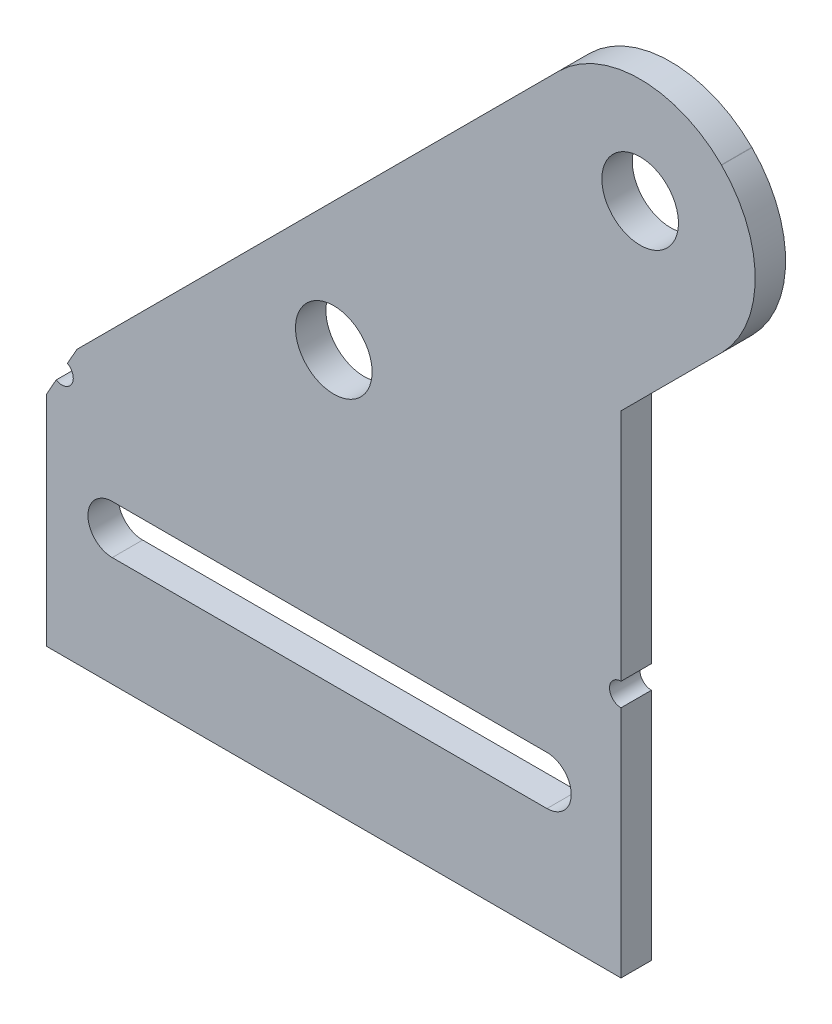
ISO-10303-21;
HEADER;
FILE_DESCRIPTION(('STEP AP214'),'2;1');
FILE_NAME('part.step','',(''),(''),'','','');
FILE_SCHEMA(('AUTOMOTIVE_DESIGN { 1 0 10303 214 1 1 1 1 }'));
ENDSEC;
DATA;
#1=APPLICATION_CONTEXT('core data for automotive mechanical design processes');
#2=APPLICATION_PROTOCOL_DEFINITION('international standard','automotive_design',2000,#1);
#3=PRODUCT_CONTEXT('',#1,'mechanical');
#4=PRODUCT('Part','Part','',(#3));
#5=PRODUCT_RELATED_PRODUCT_CATEGORY('part','',(#4));
#6=PRODUCT_DEFINITION_FORMATION('','',#4);
#7=PRODUCT_DEFINITION_CONTEXT('part definition',#1,'design');
#8=PRODUCT_DEFINITION('design','',#6,#7);
#9=PRODUCT_DEFINITION_SHAPE('','',#8);
#10=(LENGTH_UNIT() NAMED_UNIT(*) SI_UNIT(.MILLI.,.METRE.));
#11=(NAMED_UNIT(*) PLANE_ANGLE_UNIT() SI_UNIT($,.RADIAN.));
#12=(NAMED_UNIT(*) SI_UNIT($,.STERADIAN.) SOLID_ANGLE_UNIT());
#13=UNCERTAINTY_MEASURE_WITH_UNIT(LENGTH_MEASURE(1.E-05),#10,'distance_accuracy_value','');
#14=(GEOMETRIC_REPRESENTATION_CONTEXT(3) GLOBAL_UNCERTAINTY_ASSIGNED_CONTEXT((#13)) GLOBAL_UNIT_ASSIGNED_CONTEXT((#10,
#11,#12)) REPRESENTATION_CONTEXT('',''));
#15=CARTESIAN_POINT('',(0.,0.,0.));
#16=DIRECTION('',(0.,0.,1.));
#17=DIRECTION('',(1.,0.,0.));
#18=AXIS2_PLACEMENT_3D('',#15,#16,#17);
#19=CARTESIAN_POINT('',(75.,6.78692044405827,0.));
#20=DIRECTION('',(-1.,0.,0.));
#21=DIRECTION('',(0.,-1.,0.));
#22=AXIS2_PLACEMENT_3D('',#19,#20,#21);
#23=PLANE('',#22);
#24=DIRECTION('',(0.,0.,1.));
#25=VECTOR('',#24,1.);
#26=CARTESIAN_POINT('',(75.,-2.10653977797087,-2.0625));
#27=LINE('',#26,#25);
#28=CARTESIAN_POINT('',(75.,-2.10653977797087,7.9375));
#29=VERTEX_POINT('',#28);
#30=CARTESIAN_POINT('',(75.,-2.10653977797087,0.));
#31=VERTEX_POINT('',#30);
#32=EDGE_CURVE('E157',#29,#31,#27,.F.);
#33=ORIENTED_EDGE('',*,*,#32,.F.);
#34=DIRECTION('',(0.,-1.,0.));
#35=VECTOR('',#34,1.);
#36=CARTESIAN_POINT('',(75.,6.78692044405827,7.9375));
#37=LINE('',#36,#35);
#38=CARTESIAN_POINT('',(75.,-63.2130795559417,7.9375));
#39=VERTEX_POINT('',#38);
#40=EDGE_CURVE('E167',#29,#39,#37,.T.);
#41=ORIENTED_EDGE('',*,*,#40,.T.);
#42=DIRECTION('',(0.,0.,-1.));
#43=VECTOR('',#42,1.);
#44=CARTESIAN_POINT('',(75.,-63.2130795559417,0.));
#45=LINE('',#44,#43);
#46=CARTESIAN_POINT('',(75.,-63.2130795559417,0.));
#47=VERTEX_POINT('',#46);
#48=EDGE_CURVE('E201',#39,#47,#45,.T.);
#49=ORIENTED_EDGE('',*,*,#48,.T.);
#50=DIRECTION('',(0.,-1.,0.));
#51=VECTOR('',#50,1.);
#52=CARTESIAN_POINT('',(75.,6.78692044405827,0.));
#53=LINE('',#52,#51);
#54=EDGE_CURVE('E169',#31,#47,#53,.T.);
#55=ORIENTED_EDGE('',*,*,#54,.F.);
#56=EDGE_LOOP('',(#33,#41,#49,#55));
#57=FACE_BOUND('',#56,.T.);
#58=ADVANCED_FACE('F39',(#57),#23,.F.);
#59=CARTESIAN_POINT('',(-75.,-6.15057955594176,3.96875));
#60=DIRECTION('',(-0.87123298207243,0.49086972910252,0.));
#61=DIRECTION('',(0.49086972910252,0.87123298207243,0.));
#62=AXIS2_PLACEMENT_3D('',#59,#60,#61);
#63=PLANE('',#62);
#64=DIRECTION('',(0.,0.,1.));
#65=VECTOR('',#64,1.);
#66=CARTESIAN_POINT('',(-72.5038591873076,-1.72023872418816,-2.0625));
#67=LINE('',#66,#65);
#68=CARTESIAN_POINT('',(-72.5038591873076,-1.72023872418816,0.));
#69=VERTEX_POINT('',#68);
#70=CARTESIAN_POINT('',(-72.5038591873076,-1.72023872418816,7.9375));
#71=VERTEX_POINT('',#70);
#72=EDGE_CURVE('E12',#69,#71,#67,.T.);
#73=ORIENTED_EDGE('',*,*,#72,.F.);
#74=DIRECTION('',(0.49086972910252,0.87123298207243,0.));
#75=VECTOR('',#74,1.);
#76=CARTESIAN_POINT('',(-75.,-6.15057955594176,0.));
#77=LINE('',#76,#75);
#78=CARTESIAN_POINT('',(-75.,-6.15057955594173,0.));
#79=VERTEX_POINT('',#78);
#80=EDGE_CURVE('E180',#79,#69,#77,.T.);
#81=ORIENTED_EDGE('',*,*,#80,.F.);
#82=DIRECTION('',(0.,0.,1.));
#83=VECTOR('',#82,1.);
#84=CARTESIAN_POINT('',(-75.,-6.15057955594173,0.));
#85=LINE('',#84,#83);
#86=CARTESIAN_POINT('',(-75.,-6.15057955594173,7.9375));
#87=VERTEX_POINT('',#86);
#88=EDGE_CURVE('E211',#87,#79,#85,.F.);
#89=ORIENTED_EDGE('',*,*,#88,.F.);
#90=DIRECTION('',(0.49086972910252,0.87123298207243,0.));
#91=VECTOR('',#90,1.);
#92=CARTESIAN_POINT('',(-75.,-6.15057955594176,7.9375));
#93=LINE('',#92,#91);
#94=EDGE_CURVE('E213',#87,#71,#93,.T.);
#95=ORIENTED_EDGE('',*,*,#94,.T.);
#96=EDGE_LOOP('',(#73,#81,#89,#95));
#97=FACE_BOUND('',#96,.T.);
#98=ADVANCED_FACE('F339',(#97),#63,.T.);
#99=CARTESIAN_POINT('',(55.6573215127865,-28.2130795559417,0.));
#100=DIRECTION('',(0.,0.,-1.));
#101=DIRECTION('',(0.,1.,0.));
#102=AXIS2_PLACEMENT_3D('',#99,#100,#101);
#103=CYLINDRICAL_SURFACE('',#102,6.35);
#104=DIRECTION('',(0.,0.,-1.));
#105=VECTOR('',#104,1.);
#106=CARTESIAN_POINT('',(55.6573215127865,-34.5630795559417,0.));
#107=LINE('',#106,#105);
#108=CARTESIAN_POINT('',(55.6573215127865,-34.5630795559417,7.9375));
#109=VERTEX_POINT('',#108);
#110=CARTESIAN_POINT('',(55.6573215127865,-34.5630795559417,0.));
#111=VERTEX_POINT('',#110);
#112=EDGE_CURVE('E209',#109,#111,#107,.T.);
#113=ORIENTED_EDGE('',*,*,#112,.F.);
#114=CARTESIAN_POINT('',(55.6573215127865,-28.2130795559417,7.9375));
#115=DIRECTION('',(0.,0.,-1.));
#116=DIRECTION('',(0.,1.,0.));
#117=AXIS2_PLACEMENT_3D('',#114,#115,#116);
#118=CIRCLE('',#117,6.35);
#119=CARTESIAN_POINT('',(55.6573215127865,-21.8630795559417,7.9375));
#120=VERTEX_POINT('',#119);
#121=EDGE_CURVE('E193',#120,#109,#118,.T.);
#122=ORIENTED_EDGE('',*,*,#121,.F.);
#123=DIRECTION('',(0.,0.,-1.));
#124=VECTOR('',#123,1.);
#125=CARTESIAN_POINT('',(55.6573215127865,-21.8630795559417,0.));
#126=LINE('',#125,#124);
#127=CARTESIAN_POINT('',(55.6573215127865,-21.8630795559417,0.));
#128=VERTEX_POINT('',#127);
#129=EDGE_CURVE('E207',#120,#128,#126,.T.);
#130=ORIENTED_EDGE('',*,*,#129,.T.);
#131=CARTESIAN_POINT('',(55.6573215127865,-28.2130795559417,0.));
#132=DIRECTION('',(0.,0.,-1.));
#133=DIRECTION('',(0.,1.,0.));
#134=AXIS2_PLACEMENT_3D('',#131,#132,#133);
#135=CIRCLE('',#134,6.35);
#136=EDGE_CURVE('E307',#128,#111,#135,.T.);
#137=ORIENTED_EDGE('',*,*,#136,.T.);
#138=EDGE_LOOP('',(#113,#122,#130,#137));
#139=FACE_BOUND('',#138,.T.);
#140=ADVANCED_FACE('F320',(#139),#103,.F.);
#141=CARTESIAN_POINT('',(-57.854321046186,-21.8630795559417,0.));
#142=DIRECTION('',(0.,-1.,0.));
#143=DIRECTION('',(1.,0.,0.));
#144=AXIS2_PLACEMENT_3D('',#141,#142,#143);
#145=PLANE('',#144);
#146=ORIENTED_EDGE('',*,*,#129,.F.);
#147=DIRECTION('',(1.,0.,0.));
#148=VECTOR('',#147,1.);
#149=CARTESIAN_POINT('',(0.,-21.8630795559417,7.9375));
#150=LINE('',#149,#148);
#151=CARTESIAN_POINT('',(-57.854321046186,-21.8630795559417,7.9375));
#152=VERTEX_POINT('',#151);
#153=EDGE_CURVE('E189',#152,#120,#150,.T.);
#154=ORIENTED_EDGE('',*,*,#153,.F.);
#155=DIRECTION('',(0.,0.,-1.));
#156=VECTOR('',#155,1.);
#157=CARTESIAN_POINT('',(-57.854321046186,-21.8630795559417,0.));
#158=LINE('',#157,#156);
#159=CARTESIAN_POINT('',(-57.854321046186,-21.8630795559417,0.));
#160=VERTEX_POINT('',#159);
#161=EDGE_CURVE('E205',#152,#160,#158,.T.);
#162=ORIENTED_EDGE('',*,*,#161,.T.);
#163=DIRECTION('',(1.,0.,0.));
#164=VECTOR('',#163,1.);
#165=CARTESIAN_POINT('',(-57.854321046186,-21.8630795559417,0.));
#166=LINE('',#165,#164);
#167=EDGE_CURVE('E202',#160,#128,#166,.T.);
#168=ORIENTED_EDGE('',*,*,#167,.T.);
#169=EDGE_LOOP('',(#146,#154,#162,#168));
#170=FACE_BOUND('',#169,.T.);
#171=ADVANCED_FACE('F312',(#170),#145,.T.);
#172=CARTESIAN_POINT('',(-57.854321046186,-28.2130795559417,0.));
#173=DIRECTION('',(0.,0.,-1.));
#174=DIRECTION('',(0.,1.,0.));
#175=AXIS2_PLACEMENT_3D('',#172,#173,#174);
#176=CYLINDRICAL_SURFACE('',#175,6.35);
#177=ORIENTED_EDGE('',*,*,#161,.F.);
#178=CARTESIAN_POINT('',(-57.854321046186,-28.2130795559417,7.9375));
#179=DIRECTION('',(0.,0.,-1.));
#180=DIRECTION('',(0.,1.,0.));
#181=AXIS2_PLACEMENT_3D('',#178,#179,#180);
#182=CIRCLE('',#181,6.35);
#183=CARTESIAN_POINT('',(-57.854321046186,-34.5630795559417,7.9375));
#184=VERTEX_POINT('',#183);
#185=EDGE_CURVE('E185',#184,#152,#182,.T.);
#186=ORIENTED_EDGE('',*,*,#185,.F.);
#187=DIRECTION('',(0.,0.,-1.));
#188=VECTOR('',#187,1.);
#189=CARTESIAN_POINT('',(-57.854321046186,-34.5630795559417,0.));
#190=LINE('',#189,#188);
#191=CARTESIAN_POINT('',(-57.854321046186,-34.5630795559417,0.));
#192=VERTEX_POINT('',#191);
#193=EDGE_CURVE('E204',#184,#192,#190,.T.);
#194=ORIENTED_EDGE('',*,*,#193,.T.);
#195=CARTESIAN_POINT('',(-57.854321046186,-28.2130795559417,0.));
#196=DIRECTION('',(0.,0.,-1.));
#197=DIRECTION('',(0.,1.,0.));
#198=AXIS2_PLACEMENT_3D('',#195,#196,#197);
#199=CIRCLE('',#198,6.35);
#200=EDGE_CURVE('E301',#192,#160,#199,.T.);
#201=ORIENTED_EDGE('',*,*,#200,.T.);
#202=EDGE_LOOP('',(#177,#186,#194,#201));
#203=FACE_BOUND('',#202,.T.);
#204=ADVANCED_FACE('F325',(#203),#176,.F.);
#205=DIRECTION('',(0.,0.,1.));
#206=VECTOR('',#205,1.);
#207=CARTESIAN_POINT('',(75.,3.89346022202914,-2.0625));
#208=LINE('',#207,#206);
#209=CARTESIAN_POINT('',(75.,3.89346022202914,0.));
#210=VERTEX_POINT('',#209);
#211=CARTESIAN_POINT('',(75.,3.89346022202914,7.9375));
#212=VERTEX_POINT('',#211);
#213=EDGE_CURVE('E54',#210,#212,#208,.T.);
#214=ORIENTED_EDGE('',*,*,#213,.F.);
#215=CARTESIAN_POINT('',(75.,65.0472719955607,0.));
#216=VERTEX_POINT('',#215);
#217=EDGE_CURVE('E295',#216,#210,#53,.T.);
#218=ORIENTED_EDGE('',*,*,#217,.F.);
#219=DIRECTION('',(0.,0.,-1.));
#220=VECTOR('',#219,1.);
#221=CARTESIAN_POINT('',(75.,65.0472719955607,0.));
#222=LINE('',#221,#220);
#223=CARTESIAN_POINT('',(75.,65.0472719955607,7.9375));
#224=VERTEX_POINT('',#223);
#225=EDGE_CURVE('E284',#224,#216,#222,.T.);
#226=ORIENTED_EDGE('',*,*,#225,.F.);
#227=EDGE_CURVE('E177',#224,#212,#37,.T.);
#228=ORIENTED_EDGE('',*,*,#227,.T.);
#229=EDGE_LOOP('',(#214,#218,#226,#228));
#230=FACE_BOUND('',#229,.T.);
#231=ADVANCED_FACE('F341',(#230),#23,.F.);
#232=CARTESIAN_POINT('',(-75.,-63.2130795559417,0.));
#233=DIRECTION('',(0.,1.,0.));
#234=DIRECTION('',(-1.,0.,0.));
#235=AXIS2_PLACEMENT_3D('',#232,#233,#234);
#236=PLANE('',#235);
#237=ORIENTED_EDGE('',*,*,#48,.F.);
#238=DIRECTION('',(1.,0.,0.));
#239=VECTOR('',#238,1.);
#240=CARTESIAN_POINT('',(0.,-63.2130795559417,7.9375));
#241=LINE('',#240,#239);
#242=CARTESIAN_POINT('',(-75.,-63.2130795559417,7.9375));
#243=VERTEX_POINT('',#242);
#244=EDGE_CURVE('E176',#39,#243,#241,.F.);
#245=ORIENTED_EDGE('',*,*,#244,.T.);
#246=DIRECTION('',(0.,0.,-1.));
#247=VECTOR('',#246,1.);
#248=CARTESIAN_POINT('',(-75.,-63.2130795559417,0.));
#249=LINE('',#248,#247);
#250=CARTESIAN_POINT('',(-75.,-63.2130795559417,0.));
#251=VERTEX_POINT('',#250);
#252=EDGE_CURVE('E199',#243,#251,#249,.T.);
#253=ORIENTED_EDGE('',*,*,#252,.T.);
#254=DIRECTION('',(-1.,0.,0.));
#255=VECTOR('',#254,1.);
#256=CARTESIAN_POINT('',(-75.,-63.2130795559417,0.));
#257=LINE('',#256,#255);
#258=EDGE_CURVE('E298',#47,#251,#257,.T.);
#259=ORIENTED_EDGE('',*,*,#258,.F.);
#260=EDGE_LOOP('',(#237,#245,#253,#259));
#261=FACE_BOUND('',#260,.T.);
#262=ADVANCED_FACE('F334',(#261),#236,.F.);
#263=CARTESIAN_POINT('',(-75.,6.78692044405827,0.));
#264=DIRECTION('',(1.,0.,0.));
#265=DIRECTION('',(0.,1.,0.));
#266=AXIS2_PLACEMENT_3D('',#263,#264,#265);
#267=PLANE('',#266);
#268=ORIENTED_EDGE('',*,*,#252,.F.);
#269=DIRECTION('',(0.,-1.,0.));
#270=VECTOR('',#269,1.);
#271=CARTESIAN_POINT('',(-75.,6.78692044405827,7.9375));
#272=LINE('',#271,#270);
#273=EDGE_CURVE('E178',#243,#87,#272,.F.);
#274=ORIENTED_EDGE('',*,*,#273,.T.);
#275=ORIENTED_EDGE('',*,*,#88,.T.);
#276=DIRECTION('',(0.,1.,0.));
#277=VECTOR('',#276,1.);
#278=CARTESIAN_POINT('',(-75.,6.78692044405827,0.));
#279=LINE('',#278,#277);
#280=EDGE_CURVE('E192',#251,#79,#279,.T.);
#281=ORIENTED_EDGE('',*,*,#280,.F.);
#282=EDGE_LOOP('',(#268,#274,#275,#281));
#283=FACE_BOUND('',#282,.T.);
#284=ADVANCED_FACE('F329',(#283),#267,.F.);
#285=CARTESIAN_POINT('',(-57.854321046186,-34.5630795559417,0.));
#286=DIRECTION('',(0.,1.,0.));
#287=DIRECTION('',(-1.,0.,0.));
#288=AXIS2_PLACEMENT_3D('',#285,#286,#287);
#289=PLANE('',#288);
#290=DIRECTION('',(1.,0.,0.));
#291=VECTOR('',#290,1.);
#292=CARTESIAN_POINT('',(0.,-34.5630795559417,7.9375));
#293=LINE('',#292,#291);
#294=EDGE_CURVE('E188',#109,#184,#293,.F.);
#295=ORIENTED_EDGE('',*,*,#294,.F.);
#296=ORIENTED_EDGE('',*,*,#112,.T.);
#297=DIRECTION('',(-1.,0.,0.));
#298=VECTOR('',#297,1.);
#299=CARTESIAN_POINT('',(-57.854321046186,-34.5630795559417,0.));
#300=LINE('',#299,#298);
#301=EDGE_CURVE('E304',#111,#192,#300,.T.);
#302=ORIENTED_EDGE('',*,*,#301,.T.);
#303=ORIENTED_EDGE('',*,*,#193,.F.);
#304=EDGE_LOOP('',(#295,#296,#302,#303));
#305=FACE_BOUND('',#304,.T.);
#306=ADVANCED_FACE('F327',(#305),#289,.T.);
#307=CARTESIAN_POINT('',(0.,32.5735931288073,0.));
#308=DIRECTION('',(0.,0.,-1.));
#309=DIRECTION('',(-1.,0.,0.));
#310=AXIS2_PLACEMENT_3D('',#307,#308,#309);
#311=PLANE('',#310);
#312=CARTESIAN_POINT('',(75.,0.893460222029135,0.));
#313=DIRECTION('',(0.,0.,-1.));
#314=DIRECTION('',(-1.,0.,0.));
#315=AXIS2_PLACEMENT_3D('',#312,#313,#314);
#316=CIRCLE('',#315,3.00000000000001);
#317=EDGE_CURVE('E162',#31,#210,#316,.T.);
#318=ORIENTED_EDGE('',*,*,#317,.F.);
#319=ORIENTED_EDGE('',*,*,#54,.T.);
#320=ORIENTED_EDGE('',*,*,#258,.T.);
#321=ORIENTED_EDGE('',*,*,#280,.T.);
#322=ORIENTED_EDGE('',*,*,#80,.T.);
#323=CARTESIAN_POINT('',(-71.03125,0.893460222029136,0.));
#324=DIRECTION('',(0.,0.,-1.));
#325=DIRECTION('',(-1.,0.,0.));
#326=AXIS2_PLACEMENT_3D('',#323,#324,#325);
#327=CIRCLE('',#326,3.00000000000001);
#328=CARTESIAN_POINT('',(-69.5586408126924,3.50715916824643,0.));
#329=VERTEX_POINT('',#328);
#330=EDGE_CURVE('E225',#329,#69,#327,.T.);
#331=ORIENTED_EDGE('',*,*,#330,.F.);
#332=CARTESIAN_POINT('',(-67.0625,7.9375,0.));
#333=VERTEX_POINT('',#332);
#334=EDGE_CURVE('E216',#329,#333,#77,.T.);
#335=ORIENTED_EDGE('',*,*,#334,.T.);
#336=DIRECTION('',(-0.707106781186546,-0.707106781186549,0.));
#337=VECTOR('',#336,1.);
#338=CARTESIAN_POINT('',(-75.,0.,0.));
#339=LINE('',#338,#337);
#340=CARTESIAN_POINT('',(58.7867965644033,133.786796564402,0.));
#341=VERTEX_POINT('',#340);
#342=EDGE_CURVE('E245',#341,#333,#339,.T.);
#343=ORIENTED_EDGE('',*,*,#342,.F.);
#344=CARTESIAN_POINT('',(79.9999999999998,112.573593128806,0.));
#345=DIRECTION('',(0.,0.,-1.));
#346=DIRECTION('',(-1.,0.,0.));
#347=AXIS2_PLACEMENT_3D('',#344,#345,#346);
#348=CIRCLE('',#347,30.);
#349=CARTESIAN_POINT('',(101.213203435596,133.786796564402,0.));
#350=VERTEX_POINT('',#349);
#351=EDGE_CURVE('E267',#341,#350,#348,.T.);
#352=ORIENTED_EDGE('',*,*,#351,.T.);
#353=DIRECTION('',(0.707106781186548,-0.707106781186548,0.));
#354=VECTOR('',#353,1.);
#355=CARTESIAN_POINT('',(101.213203435596,133.786796564402,0.));
#356=LINE('',#355,#354);
#357=CARTESIAN_POINT('',(101.263160566622,133.736839433376,0.));
#358=VERTEX_POINT('',#357);
#359=EDGE_CURVE('E264',#350,#358,#356,.T.);
#360=ORIENTED_EDGE('',*,*,#359,.T.);
#361=CARTESIAN_POINT('',(80.0499571310259,112.523635997779,0.));
#362=DIRECTION('',(0.,0.,-1.));
#363=DIRECTION('',(-1.,0.,0.));
#364=AXIS2_PLACEMENT_3D('',#361,#362,#363);
#365=CIRCLE('',#364,30.);
#366=CARTESIAN_POINT('',(101.263160566622,91.3104325621828,0.));
#367=VERTEX_POINT('',#366);
#368=EDGE_CURVE('E261',#358,#367,#365,.T.);
#369=ORIENTED_EDGE('',*,*,#368,.T.);
#370=DIRECTION('',(-0.707106781186549,-0.707106781186546,0.));
#371=VECTOR('',#370,1.);
#372=CARTESIAN_POINT('',(101.263160566622,91.3104325621828,0.));
#373=LINE('',#372,#371);
#374=EDGE_CURVE('E258',#367,#216,#373,.T.);
#375=ORIENTED_EDGE('',*,*,#374,.T.);
#376=ORIENTED_EDGE('',*,*,#217,.T.);
#377=EDGE_LOOP('',(#318,#319,#320,#321,#322,#331,#335,#343,#352,#360,#369,#375,#376));
#378=FACE_BOUND('',#377,.T.);
#379=ORIENTED_EDGE('',*,*,#200,.F.);
#380=ORIENTED_EDGE('',*,*,#301,.F.);
#381=ORIENTED_EDGE('',*,*,#136,.F.);
#382=ORIENTED_EDGE('',*,*,#167,.F.);
#383=EDGE_LOOP('',(#379,#380,#381,#382));
#384=FACE_BOUND('',#383,.T.);
#385=CARTESIAN_POINT('',(0.,41.325890400855,0.));
#386=DIRECTION('',(0.,0.,1.));
#387=DIRECTION('',(1.,0.,0.));
#388=AXIS2_PLACEMENT_3D('',#385,#386,#387);
#389=CIRCLE('',#388,10.);
#390=CARTESIAN_POINT('',(10.,41.325890400855,0.));
#391=VERTEX_POINT('',#390);
#392=EDGE_CURVE('E252',#391,#391,#389,.T.);
#393=ORIENTED_EDGE('',*,*,#392,.T.);
#394=EDGE_LOOP('',(#393));
#395=FACE_BOUND('',#394,.T.);
#396=CARTESIAN_POINT('',(80.,115.,0.));
#397=DIRECTION('',(0.,0.,-1.));
#398=DIRECTION('',(-1.,0.,0.));
#399=AXIS2_PLACEMENT_3D('',#396,#397,#398);
#400=CIRCLE('',#399,9.99999999999999);
#401=CARTESIAN_POINT('',(70.,115.,0.));
#402=VERTEX_POINT('',#401);
#403=EDGE_CURVE('E224',#402,#402,#400,.T.);
#404=ORIENTED_EDGE('',*,*,#403,.F.);
#405=EDGE_LOOP('',(#404));
#406=FACE_BOUND('',#405,.T.);
#407=ADVANCED_FACE('F41',(#378,#384,#395,#406),#311,.T.);
#408=CARTESIAN_POINT('',(0.,6.78692044405827,7.9375));
#409=DIRECTION('',(0.,0.,1.));
#410=DIRECTION('',(0.,-1.,0.));
#411=AXIS2_PLACEMENT_3D('',#408,#409,#410);
#412=PLANE('',#411);
#413=CARTESIAN_POINT('',(75.,0.893460222029135,7.9375));
#414=DIRECTION('',(0.,0.,1.));
#415=DIRECTION('',(1.,0.,0.));
#416=AXIS2_PLACEMENT_3D('',#413,#414,#415);
#417=CIRCLE('',#416,3.00000000000001);
#418=EDGE_CURVE('E154',#212,#29,#417,.T.);
#419=ORIENTED_EDGE('',*,*,#418,.F.);
#420=ORIENTED_EDGE('',*,*,#227,.F.);
#421=DIRECTION('',(-0.707106781186549,-0.707106781186546,0.));
#422=VECTOR('',#421,1.);
#423=CARTESIAN_POINT('',(101.263160566622,91.3104325621828,7.9375));
#424=LINE('',#423,#422);
#425=CARTESIAN_POINT('',(101.263160566622,91.3104325621828,7.9375));
#426=VERTEX_POINT('',#425);
#427=EDGE_CURVE('E287',#426,#224,#424,.T.);
#428=ORIENTED_EDGE('',*,*,#427,.F.);
#429=CARTESIAN_POINT('',(80.0499571310259,112.523635997779,7.9375));
#430=DIRECTION('',(0.,0.,-1.));
#431=DIRECTION('',(-1.,0.,0.));
#432=AXIS2_PLACEMENT_3D('',#429,#430,#431);
#433=CIRCLE('',#432,30.);
#434=CARTESIAN_POINT('',(101.263160566622,133.736839433376,7.9375));
#435=VERTEX_POINT('',#434);
#436=EDGE_CURVE('E281',#435,#426,#433,.T.);
#437=ORIENTED_EDGE('',*,*,#436,.F.);
#438=DIRECTION('',(0.707106781186548,-0.707106781186548,0.));
#439=VECTOR('',#438,1.);
#440=CARTESIAN_POINT('',(101.213203435596,133.786796564402,7.9375));
#441=LINE('',#440,#439);
#442=CARTESIAN_POINT('',(101.213203435596,133.786796564402,7.9375));
#443=VERTEX_POINT('',#442);
#444=EDGE_CURVE('E276',#443,#435,#441,.T.);
#445=ORIENTED_EDGE('',*,*,#444,.F.);
#446=CARTESIAN_POINT('',(79.9999999999998,112.573593128806,7.9375));
#447=DIRECTION('',(0.,0.,-1.));
#448=DIRECTION('',(-1.,0.,0.));
#449=AXIS2_PLACEMENT_3D('',#446,#447,#448);
#450=CIRCLE('',#449,30.);
#451=CARTESIAN_POINT('',(58.7867965644033,133.786796564402,7.9375));
#452=VERTEX_POINT('',#451);
#453=EDGE_CURVE('E271',#452,#443,#450,.T.);
#454=ORIENTED_EDGE('',*,*,#453,.F.);
#455=DIRECTION('',(-0.707106781186546,-0.707106781186549,0.));
#456=VECTOR('',#455,1.);
#457=CARTESIAN_POINT('',(-75.,0.,7.9375));
#458=LINE('',#457,#456);
#459=CARTESIAN_POINT('',(-67.0625,7.9375,7.9375));
#460=VERTEX_POINT('',#459);
#461=EDGE_CURVE('E244',#452,#460,#458,.T.);
#462=ORIENTED_EDGE('',*,*,#461,.T.);
#463=CARTESIAN_POINT('',(-69.5586408126924,3.50715916824643,7.9375));
#464=VERTEX_POINT('',#463);
#465=EDGE_CURVE('E217',#464,#460,#93,.T.);
#466=ORIENTED_EDGE('',*,*,#465,.F.);
#467=CARTESIAN_POINT('',(-71.03125,0.893460222029136,7.9375));
#468=DIRECTION('',(0.,0.,1.));
#469=DIRECTION('',(1.,0.,0.));
#470=AXIS2_PLACEMENT_3D('',#467,#468,#469);
#471=CIRCLE('',#470,3.00000000000001);
#472=EDGE_CURVE('E61',#71,#464,#471,.T.);
#473=ORIENTED_EDGE('',*,*,#472,.F.);
#474=ORIENTED_EDGE('',*,*,#94,.F.);
#475=ORIENTED_EDGE('',*,*,#273,.F.);
#476=ORIENTED_EDGE('',*,*,#244,.F.);
#477=ORIENTED_EDGE('',*,*,#40,.F.);
#478=EDGE_LOOP('',(#419,#420,#428,#437,#445,#454,#462,#466,#473,#474,#475,#476,#477));
#479=FACE_BOUND('',#478,.T.);
#480=ORIENTED_EDGE('',*,*,#185,.T.);
#481=ORIENTED_EDGE('',*,*,#153,.T.);
#482=ORIENTED_EDGE('',*,*,#121,.T.);
#483=ORIENTED_EDGE('',*,*,#294,.T.);
#484=EDGE_LOOP('',(#480,#481,#482,#483));
#485=FACE_BOUND('',#484,.T.);
#486=CARTESIAN_POINT('',(0.,41.325890400855,7.9375));
#487=DIRECTION('',(0.,0.,1.));
#488=DIRECTION('',(1.,0.,0.));
#489=AXIS2_PLACEMENT_3D('',#486,#487,#488);
#490=CIRCLE('',#489,10.);
#491=CARTESIAN_POINT('',(10.,41.325890400855,7.9375));
#492=VERTEX_POINT('',#491);
#493=EDGE_CURVE('E290',#492,#492,#490,.T.);
#494=ORIENTED_EDGE('',*,*,#493,.F.);
#495=EDGE_LOOP('',(#494));
#496=FACE_BOUND('',#495,.T.);
#497=CARTESIAN_POINT('',(80.,115.,7.9375));
#498=DIRECTION('',(0.,0.,-1.));
#499=DIRECTION('',(-1.,0.,0.));
#500=AXIS2_PLACEMENT_3D('',#497,#498,#499);
#501=CIRCLE('',#500,9.99999999999999);
#502=CARTESIAN_POINT('',(70.,115.,7.9375));
#503=VERTEX_POINT('',#502);
#504=EDGE_CURVE('E250',#503,#503,#501,.T.);
#505=ORIENTED_EDGE('',*,*,#504,.T.);
#506=EDGE_LOOP('',(#505));
#507=FACE_BOUND('',#506,.T.);
#508=ADVANCED_FACE('F172',(#479,#485,#496,#507),#412,.T.);
#509=DIRECTION('',(0.,0.,1.));
#510=VECTOR('',#509,1.);
#511=CARTESIAN_POINT('',(-69.5586408126924,3.50715916824643,-2.0625));
#512=LINE('',#511,#510);
#513=EDGE_CURVE('E47',#464,#329,#512,.F.);
#514=ORIENTED_EDGE('',*,*,#513,.F.);
#515=ORIENTED_EDGE('',*,*,#465,.T.);
#516=DIRECTION('',(0.,0.,-1.));
#517=VECTOR('',#516,1.);
#518=CARTESIAN_POINT('',(-67.0625,7.9375,3.96875));
#519=LINE('',#518,#517);
#520=EDGE_CURVE('E222',#460,#333,#519,.T.);
#521=ORIENTED_EDGE('',*,*,#520,.T.);
#522=ORIENTED_EDGE('',*,*,#334,.F.);
#523=EDGE_LOOP('',(#514,#515,#521,#522));
#524=FACE_BOUND('',#523,.T.);
#525=ADVANCED_FACE('F238',(#524),#63,.T.);
#526=CARTESIAN_POINT('',(80.,115.,0.));
#527=DIRECTION('',(0.,0.,-1.));
#528=DIRECTION('',(-1.,0.,0.));
#529=AXIS2_PLACEMENT_3D('',#526,#527,#528);
#530=CYLINDRICAL_SURFACE('',#529,9.99999999999999);
#531=ORIENTED_EDGE('',*,*,#403,.T.);
#532=EDGE_LOOP('',(#531));
#533=FACE_BOUND('',#532,.T.);
#534=ORIENTED_EDGE('',*,*,#504,.F.);
#535=EDGE_LOOP('',(#534));
#536=FACE_BOUND('',#535,.T.);
#537=ADVANCED_FACE('F380',(#533,#536),#530,.F.);
#538=CARTESIAN_POINT('',(0.,41.325890400855,0.));
#539=DIRECTION('',(0.,0.,1.));
#540=DIRECTION('',(1.,0.,0.));
#541=AXIS2_PLACEMENT_3D('',#538,#539,#540);
#542=CYLINDRICAL_SURFACE('',#541,10.);
#543=ORIENTED_EDGE('',*,*,#392,.F.);
#544=EDGE_LOOP('',(#543));
#545=FACE_BOUND('',#544,.T.);
#546=ORIENTED_EDGE('',*,*,#493,.T.);
#547=EDGE_LOOP('',(#546));
#548=FACE_BOUND('',#547,.T.);
#549=ADVANCED_FACE('F382',(#545,#548),#542,.F.);
#550=CARTESIAN_POINT('',(101.263160566622,91.3104325621828,0.));
#551=DIRECTION('',(0.707106781186546,-0.707106781186549,0.));
#552=DIRECTION('',(-0.707106781186549,-0.707106781186546,0.));
#553=AXIS2_PLACEMENT_3D('',#550,#551,#552);
#554=PLANE('',#553);
#555=DIRECTION('',(0.,0.,-1.));
#556=VECTOR('',#555,1.);
#557=CARTESIAN_POINT('',(101.263160566622,91.3104325621828,0.));
#558=LINE('',#557,#556);
#559=EDGE_CURVE('E279',#426,#367,#558,.T.);
#560=ORIENTED_EDGE('',*,*,#559,.F.);
#561=ORIENTED_EDGE('',*,*,#427,.T.);
#562=ORIENTED_EDGE('',*,*,#225,.T.);
#563=ORIENTED_EDGE('',*,*,#374,.F.);
#564=EDGE_LOOP('',(#560,#561,#562,#563));
#565=FACE_BOUND('',#564,.T.);
#566=ADVANCED_FACE('F361',(#565),#554,.T.);
#567=CARTESIAN_POINT('',(80.0499571310259,112.523635997779,0.));
#568=DIRECTION('',(0.,0.,-1.));
#569=DIRECTION('',(-1.,0.,0.));
#570=AXIS2_PLACEMENT_3D('',#567,#568,#569);
#571=CYLINDRICAL_SURFACE('',#570,30.);
#572=DIRECTION('',(0.,0.,-1.));
#573=VECTOR('',#572,1.);
#574=CARTESIAN_POINT('',(101.263160566622,133.736839433376,0.));
#575=LINE('',#574,#573);
#576=EDGE_CURVE('E274',#435,#358,#575,.T.);
#577=ORIENTED_EDGE('',*,*,#576,.F.);
#578=ORIENTED_EDGE('',*,*,#436,.T.);
#579=ORIENTED_EDGE('',*,*,#559,.T.);
#580=ORIENTED_EDGE('',*,*,#368,.F.);
#581=EDGE_LOOP('',(#577,#578,#579,#580));
#582=FACE_BOUND('',#581,.T.);
#583=ADVANCED_FACE('F366',(#582),#571,.T.);
#584=CARTESIAN_POINT('',(101.213203435596,133.786796564402,0.));
#585=DIRECTION('',(0.707106781186548,0.707106781186548,0.));
#586=DIRECTION('',(0.707106781186548,-0.707106781186548,0.));
#587=AXIS2_PLACEMENT_3D('',#584,#585,#586);
#588=PLANE('',#587);
#589=DIRECTION('',(0.,0.,-1.));
#590=VECTOR('',#589,1.);
#591=CARTESIAN_POINT('',(101.213203435596,133.786796564402,0.));
#592=LINE('',#591,#590);
#593=EDGE_CURVE('E269',#443,#350,#592,.T.);
#594=ORIENTED_EDGE('',*,*,#593,.F.);
#595=ORIENTED_EDGE('',*,*,#444,.T.);
#596=ORIENTED_EDGE('',*,*,#576,.T.);
#597=ORIENTED_EDGE('',*,*,#359,.F.);
#598=EDGE_LOOP('',(#594,#595,#596,#597));
#599=FACE_BOUND('',#598,.T.);
#600=ADVANCED_FACE('F369',(#599),#588,.T.);
#601=CARTESIAN_POINT('',(79.9999999999998,112.573593128806,0.));
#602=DIRECTION('',(0.,0.,-1.));
#603=DIRECTION('',(-1.,0.,0.));
#604=AXIS2_PLACEMENT_3D('',#601,#602,#603);
#605=CYLINDRICAL_SURFACE('',#604,30.);
#606=DIRECTION('',(0.,0.,-1.));
#607=VECTOR('',#606,1.);
#608=CARTESIAN_POINT('',(58.7867965644033,133.786796564402,0.));
#609=LINE('',#608,#607);
#610=EDGE_CURVE('E246',#452,#341,#609,.T.);
#611=ORIENTED_EDGE('',*,*,#610,.F.);
#612=ORIENTED_EDGE('',*,*,#453,.T.);
#613=ORIENTED_EDGE('',*,*,#593,.T.);
#614=ORIENTED_EDGE('',*,*,#351,.F.);
#615=EDGE_LOOP('',(#611,#612,#613,#614));
#616=FACE_BOUND('',#615,.T.);
#617=ADVANCED_FACE('F371',(#616),#605,.T.);
#618=CARTESIAN_POINT('',(-75.,0.,0.));
#619=DIRECTION('',(0.707106781186549,-0.707106781186546,0.));
#620=DIRECTION('',(-0.707106781186546,-0.707106781186549,0.));
#621=AXIS2_PLACEMENT_3D('',#618,#619,#620);
#622=PLANE('',#621);
#623=ORIENTED_EDGE('',*,*,#520,.F.);
#624=ORIENTED_EDGE('',*,*,#461,.F.);
#625=ORIENTED_EDGE('',*,*,#610,.T.);
#626=ORIENTED_EDGE('',*,*,#342,.T.);
#627=EDGE_LOOP('',(#623,#624,#625,#626));
#628=FACE_BOUND('',#627,.T.);
#629=ADVANCED_FACE('F243',(#628),#622,.F.);
#630=CARTESIAN_POINT('',(-71.03125,0.893460222029136,-2.0625));
#631=DIRECTION('',(0.,0.,1.));
#632=DIRECTION('',(1.,0.,0.));
#633=AXIS2_PLACEMENT_3D('',#630,#631,#632);
#634=CYLINDRICAL_SURFACE('',#633,3.00000000000001);
#635=ORIENTED_EDGE('',*,*,#72,.T.);
#636=ORIENTED_EDGE('',*,*,#472,.T.);
#637=ORIENTED_EDGE('',*,*,#513,.T.);
#638=ORIENTED_EDGE('',*,*,#330,.T.);
#639=EDGE_LOOP('',(#635,#636,#637,#638));
#640=FACE_BOUND('',#639,.T.);
#641=ADVANCED_FACE('F227',(#640),#634,.F.);
#642=CARTESIAN_POINT('',(75.,0.893460222029135,-2.0625));
#643=DIRECTION('',(0.,0.,1.));
#644=DIRECTION('',(1.,0.,0.));
#645=AXIS2_PLACEMENT_3D('',#642,#643,#644);
#646=CYLINDRICAL_SURFACE('',#645,3.00000000000001);
#647=ORIENTED_EDGE('',*,*,#32,.T.);
#648=ORIENTED_EDGE('',*,*,#317,.T.);
#649=ORIENTED_EDGE('',*,*,#213,.T.);
#650=ORIENTED_EDGE('',*,*,#418,.T.);
#651=EDGE_LOOP('',(#647,#648,#649,#650));
#652=FACE_BOUND('',#651,.T.);
#653=ADVANCED_FACE('F156',(#652),#646,.F.);
#654=CLOSED_SHELL('',(#58,#98,#140,#171,#204,#231,#262,#284,#306,#407,#508,#525,#537,#549,#566,
#583,#600,#617,#629,#641,#653));
#655=MANIFOLD_SOLID_BREP('B2',#654);
#656=ADVANCED_BREP_SHAPE_REPRESENTATION('',(#18,#655),#14);
#657=SHAPE_DEFINITION_REPRESENTATION(#9,#656);
ENDSEC;
END-ISO-10303-21;
